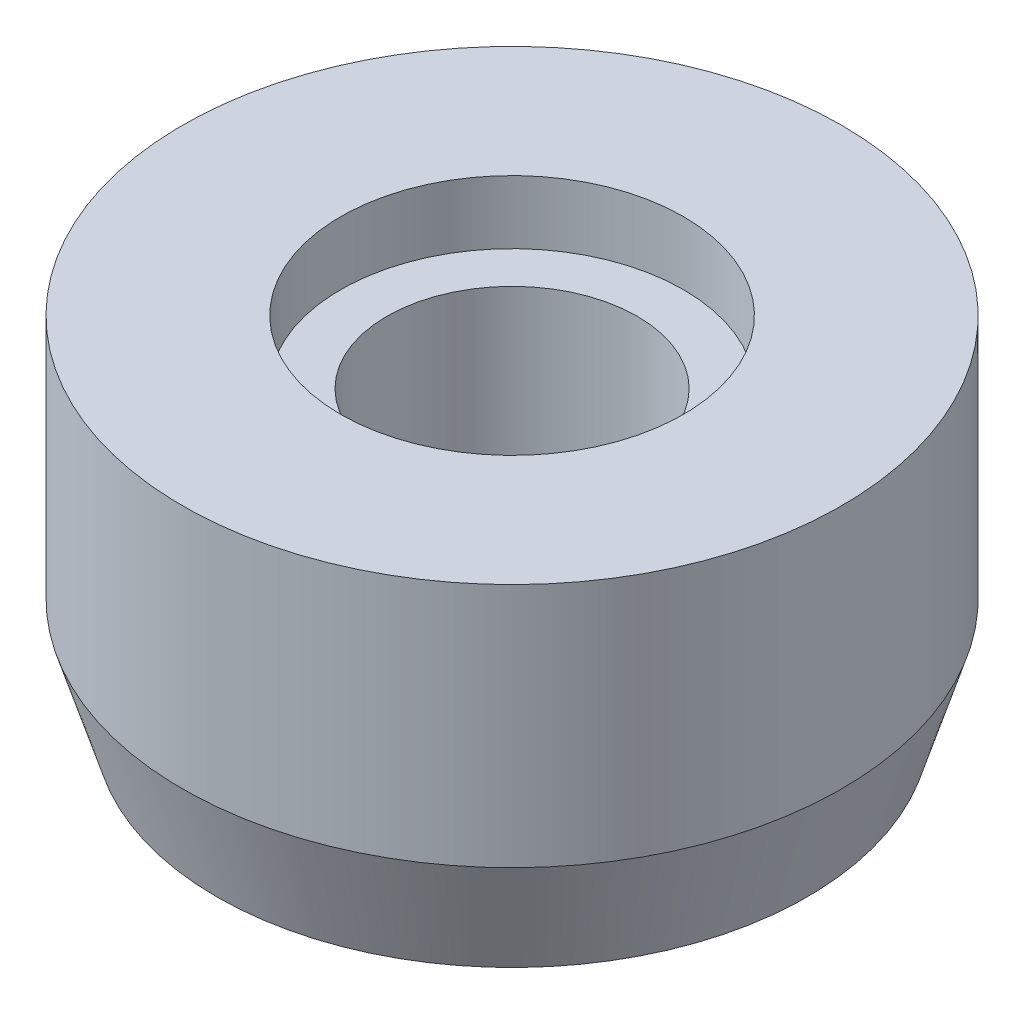
ISO-10303-21;
HEADER;
FILE_DESCRIPTION(('STEP AP214'),'2;1');
FILE_NAME('part.step','',(''),(''),'','','');
FILE_SCHEMA(('AUTOMOTIVE_DESIGN { 1 0 10303 214 1 1 1 1 }'));
ENDSEC;
DATA;
#1=APPLICATION_CONTEXT('core data for automotive mechanical design processes');
#2=APPLICATION_PROTOCOL_DEFINITION('international standard','automotive_design',2000,#1);
#3=PRODUCT_CONTEXT('',#1,'mechanical');
#4=PRODUCT('Part','Part','',(#3));
#5=PRODUCT_RELATED_PRODUCT_CATEGORY('part','',(#4));
#6=PRODUCT_DEFINITION_FORMATION('','',#4);
#7=PRODUCT_DEFINITION_CONTEXT('part definition',#1,'design');
#8=PRODUCT_DEFINITION('design','',#6,#7);
#9=PRODUCT_DEFINITION_SHAPE('','',#8);
#10=(LENGTH_UNIT() NAMED_UNIT(*) SI_UNIT(.MILLI.,.METRE.));
#11=(NAMED_UNIT(*) PLANE_ANGLE_UNIT() SI_UNIT($,.RADIAN.));
#12=(NAMED_UNIT(*) SI_UNIT($,.STERADIAN.) SOLID_ANGLE_UNIT());
#13=UNCERTAINTY_MEASURE_WITH_UNIT(LENGTH_MEASURE(1.E-05),#10,'distance_accuracy_value','');
#14=(GEOMETRIC_REPRESENTATION_CONTEXT(3) GLOBAL_UNCERTAINTY_ASSIGNED_CONTEXT((#13)) GLOBAL_UNIT_ASSIGNED_CONTEXT((#10,
#11,#12)) REPRESENTATION_CONTEXT('',''));
#15=CARTESIAN_POINT('',(0.,0.,0.));
#16=DIRECTION('',(0.,0.,1.));
#17=DIRECTION('',(1.,0.,0.));
#18=AXIS2_PLACEMENT_3D('',#15,#16,#17);
#19=CARTESIAN_POINT('',(0.,15.4978731582886,0.));
#20=DIRECTION('',(0.,-1.,0.));
#21=DIRECTION('',(0.,0.,-1.));
#22=AXIS2_PLACEMENT_3D('',#19,#20,#21);
#23=CONICAL_SURFACE('',#22,4.75,1.56922404870792);
#24=CARTESIAN_POINT('',(0.,15.487731956271,0.));
#25=DIRECTION('',(0.,-1.,0.));
#26=DIRECTION('',(0.,0.,-1.));
#27=AXIS2_PLACEMENT_3D('',#24,#25,#26);
#28=CIRCLE('',#27,11.2);
#29=CARTESIAN_POINT('',(0.,15.487731956271,-11.2));
#30=VERTEX_POINT('',#29);
#31=EDGE_CURVE('E60',#30,#30,#28,.T.);
#32=ORIENTED_EDGE('',*,*,#31,.T.);
#33=EDGE_LOOP('',(#32));
#34=FACE_BOUND('',#33,.T.);
#35=CARTESIAN_POINT('',(0.,15.4978731582886,0.));
#36=DIRECTION('',(0.,-1.,0.));
#37=DIRECTION('',(0.,0.,-1.));
#38=AXIS2_PLACEMENT_3D('',#35,#36,#37);
#39=CIRCLE('',#38,4.75);
#40=CARTESIAN_POINT('',(0.,15.4978731582886,-4.75));
#41=VERTEX_POINT('',#40);
#42=EDGE_CURVE('E10',#41,#41,#39,.T.);
#43=ORIENTED_EDGE('',*,*,#42,.F.);
#44=EDGE_LOOP('',(#43));
#45=FACE_BOUND('',#44,.T.);
#46=ADVANCED_FACE('F35',(#34,#45),#23,.F.);
#47=CARTESIAN_POINT('',(0.,0.,0.));
#48=DIRECTION('',(0.,-1.,0.));
#49=DIRECTION('',(0.,0.,-1.));
#50=AXIS2_PLACEMENT_3D('',#47,#48,#49);
#51=CYLINDRICAL_SURFACE('',#50,4.75);
#52=ORIENTED_EDGE('',*,*,#42,.T.);
#53=EDGE_LOOP('',(#52));
#54=FACE_BOUND('',#53,.T.);
#55=CARTESIAN_POINT('',(0.,26.5857046794849,0.));
#56=DIRECTION('',(0.,-1.,0.));
#57=DIRECTION('',(0.,0.,-1.));
#58=AXIS2_PLACEMENT_3D('',#55,#56,#57);
#59=CIRCLE('',#58,4.75);
#60=CARTESIAN_POINT('',(0.,26.5857046794849,-4.75));
#61=VERTEX_POINT('',#60);
#62=EDGE_CURVE('E41',#61,#61,#59,.T.);
#63=ORIENTED_EDGE('',*,*,#62,.F.);
#64=EDGE_LOOP('',(#63));
#65=FACE_BOUND('',#64,.T.);
#66=ADVANCED_FACE('F78',(#54,#65),#51,.F.);
#67=CARTESIAN_POINT('',(4.75,26.5857046794849,0.));
#68=DIRECTION('',(0.,1.,0.));
#69=DIRECTION('',(0.,0.,1.));
#70=AXIS2_PLACEMENT_3D('',#67,#68,#69);
#71=PLANE('',#70);
#72=ORIENTED_EDGE('',*,*,#62,.T.);
#73=EDGE_LOOP('',(#72));
#74=FACE_BOUND('',#73,.T.);
#75=CARTESIAN_POINT('',(0.,26.5857046794849,0.));
#76=DIRECTION('',(0.,-1.,0.));
#77=DIRECTION('',(0.,0.,-1.));
#78=AXIS2_PLACEMENT_3D('',#75,#76,#77);
#79=CIRCLE('',#78,6.5);
#80=CARTESIAN_POINT('',(0.,26.5857046794849,-6.5));
#81=VERTEX_POINT('',#80);
#82=EDGE_CURVE('E45',#81,#81,#79,.T.);
#83=ORIENTED_EDGE('',*,*,#82,.F.);
#84=EDGE_LOOP('',(#83));
#85=FACE_BOUND('',#84,.T.);
#86=ADVANCED_FACE('F82',(#74,#85),#71,.T.);
#87=CARTESIAN_POINT('',(0.,0.,0.));
#88=DIRECTION('',(0.,-1.,0.));
#89=DIRECTION('',(0.,0.,-1.));
#90=AXIS2_PLACEMENT_3D('',#87,#88,#89);
#91=CYLINDRICAL_SURFACE('',#90,6.5);
#92=ORIENTED_EDGE('',*,*,#82,.T.);
#93=EDGE_LOOP('',(#92));
#94=FACE_BOUND('',#93,.T.);
#95=CARTESIAN_POINT('',(0.,28.9857046794849,0.));
#96=DIRECTION('',(0.,-1.,0.));
#97=DIRECTION('',(0.,0.,-1.));
#98=AXIS2_PLACEMENT_3D('',#95,#96,#97);
#99=CIRCLE('',#98,6.5);
#100=CARTESIAN_POINT('',(0.,28.9857046794849,-6.5));
#101=VERTEX_POINT('',#100);
#102=EDGE_CURVE('E49',#101,#101,#99,.T.);
#103=ORIENTED_EDGE('',*,*,#102,.F.);
#104=EDGE_LOOP('',(#103));
#105=FACE_BOUND('',#104,.T.);
#106=ADVANCED_FACE('F86',(#94,#105),#91,.F.);
#107=CARTESIAN_POINT('',(6.5,28.9857046794849,0.));
#108=DIRECTION('',(0.,1.,0.));
#109=DIRECTION('',(0.,0.,1.));
#110=AXIS2_PLACEMENT_3D('',#107,#108,#109);
#111=PLANE('',#110);
#112=ORIENTED_EDGE('',*,*,#102,.T.);
#113=EDGE_LOOP('',(#112));
#114=FACE_BOUND('',#113,.T.);
#115=CARTESIAN_POINT('',(0.,28.9857046794849,0.));
#116=DIRECTION('',(0.,-1.,0.));
#117=DIRECTION('',(0.,0.,-1.));
#118=AXIS2_PLACEMENT_3D('',#115,#116,#117);
#119=CIRCLE('',#118,12.5);
#120=CARTESIAN_POINT('',(0.,28.9857046794849,-12.5));
#121=VERTEX_POINT('',#120);
#122=EDGE_CURVE('E54',#121,#121,#119,.T.);
#123=ORIENTED_EDGE('',*,*,#122,.F.);
#124=EDGE_LOOP('',(#123));
#125=FACE_BOUND('',#124,.T.);
#126=ADVANCED_FACE('F74',(#114,#125),#111,.T.);
#127=CARTESIAN_POINT('',(0.,0.,0.));
#128=DIRECTION('',(0.,-1.,0.));
#129=DIRECTION('',(0.,0.,-1.));
#130=AXIS2_PLACEMENT_3D('',#127,#128,#129);
#131=CYLINDRICAL_SURFACE('',#130,12.5);
#132=ORIENTED_EDGE('',*,*,#122,.T.);
#133=EDGE_LOOP('',(#132));
#134=FACE_BOUND('',#133,.T.);
#135=CARTESIAN_POINT('',(0.,19.6856931844016,0.));
#136=DIRECTION('',(0.,-1.,0.));
#137=DIRECTION('',(0.,0.,-1.));
#138=AXIS2_PLACEMENT_3D('',#135,#136,#137);
#139=CIRCLE('',#138,12.5);
#140=CARTESIAN_POINT('',(0.,19.6856931844016,-12.5));
#141=VERTEX_POINT('',#140);
#142=EDGE_CURVE('E57',#141,#141,#139,.T.);
#143=ORIENTED_EDGE('',*,*,#142,.F.);
#144=EDGE_LOOP('',(#143));
#145=FACE_BOUND('',#144,.T.);
#146=ADVANCED_FACE('F68',(#134,#145),#131,.T.);
#147=CARTESIAN_POINT('',(0.,15.487731956271,0.));
#148=DIRECTION('',(0.,1.,0.));
#149=DIRECTION('',(0.,0.,1.));
#150=AXIS2_PLACEMENT_3D('',#147,#148,#149);
#151=CONICAL_SURFACE('',#150,11.2,0.30030834506782);
#152=ORIENTED_EDGE('',*,*,#142,.T.);
#153=EDGE_LOOP('',(#152));
#154=FACE_BOUND('',#153,.T.);
#155=ORIENTED_EDGE('',*,*,#31,.F.);
#156=EDGE_LOOP('',(#155));
#157=FACE_BOUND('',#156,.T.);
#158=ADVANCED_FACE('F66',(#154,#157),#151,.T.);
#159=CLOSED_SHELL('',(#46,#66,#86,#106,#126,#146,#158));
#160=MANIFOLD_SOLID_BREP('B2',#159);
#161=ADVANCED_BREP_SHAPE_REPRESENTATION('',(#18,#160),#14);
#162=SHAPE_DEFINITION_REPRESENTATION(#9,#161);
ENDSEC;
END-ISO-10303-21;
